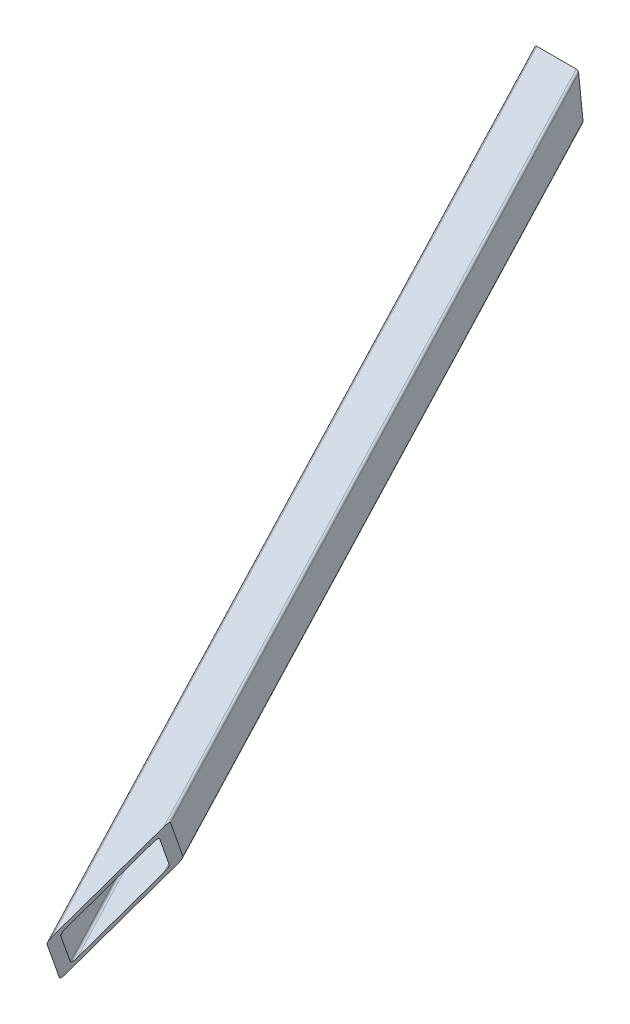
ISO-10303-21;
HEADER;
FILE_DESCRIPTION(('STEP AP214'),'2;1');
FILE_NAME('part.step','',(''),(''),'','','');
FILE_SCHEMA(('AUTOMOTIVE_DESIGN { 1 0 10303 214 1 1 1 1 }'));
ENDSEC;
DATA;
#1=APPLICATION_CONTEXT('core data for automotive mechanical design processes');
#2=APPLICATION_PROTOCOL_DEFINITION('international standard','automotive_design',2000,#1);
#3=PRODUCT_CONTEXT('',#1,'mechanical');
#4=PRODUCT('Part','Part','',(#3));
#5=PRODUCT_RELATED_PRODUCT_CATEGORY('part','',(#4));
#6=PRODUCT_DEFINITION_FORMATION('','',#4);
#7=PRODUCT_DEFINITION_CONTEXT('part definition',#1,'design');
#8=PRODUCT_DEFINITION('design','',#6,#7);
#9=PRODUCT_DEFINITION_SHAPE('','',#8);
#10=(LENGTH_UNIT() NAMED_UNIT(*) SI_UNIT(.MILLI.,.METRE.));
#11=(NAMED_UNIT(*) PLANE_ANGLE_UNIT() SI_UNIT($,.RADIAN.));
#12=(NAMED_UNIT(*) SI_UNIT($,.STERADIAN.) SOLID_ANGLE_UNIT());
#13=UNCERTAINTY_MEASURE_WITH_UNIT(LENGTH_MEASURE(1.E-05),#10,'distance_accuracy_value','');
#14=(GEOMETRIC_REPRESENTATION_CONTEXT(3) GLOBAL_UNCERTAINTY_ASSIGNED_CONTEXT((#13)) GLOBAL_UNIT_ASSIGNED_CONTEXT((#10,
#11,#12)) REPRESENTATION_CONTEXT('',''));
#15=CARTESIAN_POINT('',(0.,0.,0.));
#16=DIRECTION('',(0.,0.,1.));
#17=DIRECTION('',(1.,0.,0.));
#18=AXIS2_PLACEMENT_3D('',#15,#16,#17);
#19=CARTESIAN_POINT('',(0.,0.,0.));
#20=DIRECTION('',(0.,0.,1.));
#21=DIRECTION('',(1.,0.,0.));
#22=AXIS2_PLACEMENT_3D('',#19,#20,#21);
#23=PLANE('',#22);
#24=DIRECTION('',(-0.110232699837685,0.993905806345096,0.));
#25=VECTOR('',#24,1.);
#26=CARTESIAN_POINT('',(28.0475956269496,3.11071951705733,0.));
#27=LINE('',#26,#25);
#28=CARTESIAN_POINT('',(4.46683662482604,215.725064668228,0.));
#29=VERTEX_POINT('',#28);
#30=CARTESIAN_POINT('',(0.235096664464664,253.880266561486,0.));
#31=VERTEX_POINT('',#30);
#32=EDGE_CURVE('E176',#29,#31,#27,.T.);
#33=ORIENTED_EDGE('',*,*,#32,.T.);
#34=CARTESIAN_POINT('',(2.34358835192322,253.880844416911,0.));
#35=DIRECTION('',(0.,0.,1.));
#36=DIRECTION('',(0.709852795777389,-0.704350060926401,0.));
#37=AXIS2_PLACEMENT_3D('',#34,#35,#36);
#38=ELLIPSE('',#37,2.23478809330934,2.);
#39=CARTESIAN_POINT('',(2.10849168745858,256.000577855426,0.));
#40=VERTEX_POINT('',#39);
#41=EDGE_CURVE('E174',#31,#40,#38,.F.);
#42=ORIENTED_EDGE('',*,*,#41,.T.);
#43=DIRECTION('',(-0.999999962445275,-0.000274061030133583,0.));
#44=VECTOR('',#43,1.);
#45=CARTESIAN_POINT('',(257.929821000683,256.0706885151,0.));
#46=LINE('',#45,#44);
#47=CARTESIAN_POINT('',(40.0613420617145,256.010979253086,0.));
#48=VERTEX_POINT('',#47);
#49=EDGE_CURVE('E165',#48,#40,#46,.T.);
#50=ORIENTED_EDGE('',*,*,#49,.F.);
#51=CARTESIAN_POINT('',(40.296438726179,253.891245814572,0.));
#52=DIRECTION('',(0.,0.,1.));
#53=DIRECTION('',(-0.709852795777389,0.704350060926401,0.));
#54=AXIS2_PLACEMENT_3D('',#51,#52,#53);
#55=ELLIPSE('',#54,2.23478809330934,2.);
#56=CARTESIAN_POINT('',(42.4049304136377,253.891823669998,0.));
#57=VERTEX_POINT('',#56);
#58=EDGE_CURVE('E147',#48,#57,#55,.F.);
#59=ORIENTED_EDGE('',*,*,#58,.T.);
#60=DIRECTION('',(-0.110232699837685,0.993905806345096,0.));
#61=VECTOR('',#60,1.);
#62=CARTESIAN_POINT('',(72.8413014840615,-20.535691718011,0.));
#63=LINE('',#62,#61);
#64=CARTESIAN_POINT('',(46.6366703739991,215.73662177674,0.));
#65=VERTEX_POINT('',#64);
#66=EDGE_CURVE('E175',#65,#57,#63,.T.);
#67=ORIENTED_EDGE('',*,*,#66,.F.);
#68=CARTESIAN_POINT('',(44.5281786865403,215.736043921314,0.));
#69=DIRECTION('',(0.,0.,1.));
#70=DIRECTION('',(-0.709852795777389,0.704350060926401,0.));
#71=AXIS2_PLACEMENT_3D('',#68,#69,#70);
#72=ELLIPSE('',#71,2.23478809330934,2.);
#73=CARTESIAN_POINT('',(44.7632753510048,213.6163104828,0.));
#74=VERTEX_POINT('',#73);
#75=EDGE_CURVE('E157',#65,#74,#72,.F.);
#76=ORIENTED_EDGE('',*,*,#75,.T.);
#77=DIRECTION('',(0.999999962445275,0.000274061030133565,0.));
#78=VECTOR('',#77,1.);
#79=CARTESIAN_POINT('',(257.941440080002,213.674734312422,0.));
#80=LINE('',#79,#78);
#81=CARTESIAN_POINT('',(6.81042497674911,213.60590908514,0.));
#82=VERTEX_POINT('',#81);
#83=EDGE_CURVE('E178',#82,#74,#80,.T.);
#84=ORIENTED_EDGE('',*,*,#83,.F.);
#85=CARTESIAN_POINT('',(6.57532831228463,215.725642523654,0.));
#86=DIRECTION('',(0.,0.,1.));
#87=DIRECTION('',(-0.709852795777389,0.704350060926401,0.));
#88=AXIS2_PLACEMENT_3D('',#85,#86,#87);
#89=ELLIPSE('',#88,2.23478809330933,2.);
#90=EDGE_CURVE('E158',#82,#29,#89,.F.);
#91=ORIENTED_EDGE('',*,*,#90,.T.);
#92=EDGE_LOOP('',(#33,#42,#50,#59,#67,#76,#84,#91));
#93=FACE_BOUND('',#92,.T.);
#94=DIRECTION('',(-0.110232699837688,0.993905806345095,0.));
#95=VECTOR('',#94,1.);
#96=CARTESIAN_POINT('',(32.213464011333,3.57275014032918,0.));
#97=LINE('',#96,#95);
#98=CARTESIAN_POINT('',(8.21362667081437,219.965687256108,0.));
#99=VERTEX_POINT('',#98);
#100=CARTESIAN_POINT('',(4.92227336831102,249.641955395308,0.));
#101=VERTEX_POINT('',#100);
#102=EDGE_CURVE('E180',#99,#101,#97,.T.);
#103=ORIENTED_EDGE('',*,*,#102,.F.);
#104=CARTESIAN_POINT('',(10.3221183582731,219.966265111534,0.));
#105=DIRECTION('',(0.,0.,1.));
#106=DIRECTION('',(0.709852795777389,-0.704350060926401,0.));
#107=AXIS2_PLACEMENT_3D('',#104,#105,#106);
#108=ELLIPSE('',#107,2.23478809330934,2.);
#109=CARTESIAN_POINT('',(10.5572150227377,217.846531673019,0.));
#110=VERTEX_POINT('',#109);
#111=EDGE_CURVE('E41',#99,#110,#108,.T.);
#112=ORIENTED_EDGE('',*,*,#111,.T.);
#113=DIRECTION('',(-0.999999962445275,-0.000274061030133465,0.));
#114=VECTOR('',#113,1.);
#115=CARTESIAN_POINT('',(-0.0597024496925761,217.843621989571,0.));
#116=LINE('',#115,#114);
#117=CARTESIAN_POINT('',(40.0760986471583,217.854621648978,0.));
#118=VERTEX_POINT('',#117);
#119=EDGE_CURVE('E263',#118,#110,#116,.T.);
#120=ORIENTED_EDGE('',*,*,#119,.F.);
#121=CARTESIAN_POINT('',(39.8410019826938,219.974355087492,0.));
#122=DIRECTION('',(0.,0.,1.));
#123=DIRECTION('',(0.709852795777389,-0.704350060926401,0.));
#124=AXIS2_PLACEMENT_3D('',#121,#122,#123);
#125=ELLIPSE('',#124,2.23478809330933,2.);
#126=CARTESIAN_POINT('',(41.9494936701525,219.974932942918,0.));
#127=VERTEX_POINT('',#126);
#128=EDGE_CURVE('E257',#118,#127,#125,.T.);
#129=ORIENTED_EDGE('',*,*,#128,.T.);
#130=DIRECTION('',(0.110232699837685,-0.993905806345096,0.));
#131=VECTOR('',#130,1.);
#132=CARTESIAN_POINT('',(65.5404110863942,7.26899512650244,0.));
#133=LINE('',#132,#131);
#134=CARTESIAN_POINT('',(38.6581403676492,249.651201082118,0.));
#135=VERTEX_POINT('',#134);
#136=EDGE_CURVE('E272',#135,#127,#133,.T.);
#137=ORIENTED_EDGE('',*,*,#136,.F.);
#138=CARTESIAN_POINT('',(36.5496486801906,249.650623226692,0.));
#139=DIRECTION('',(0.,0.,1.));
#140=DIRECTION('',(0.709852795777389,-0.704350060926401,0.));
#141=AXIS2_PLACEMENT_3D('',#138,#139,#140);
#142=ELLIPSE('',#141,2.23478809330934,2.);
#143=CARTESIAN_POINT('',(36.314552015726,251.770356665207,0.));
#144=VERTEX_POINT('',#143);
#145=EDGE_CURVE('E48',#135,#144,#142,.T.);
#146=ORIENTED_EDGE('',*,*,#145,.T.);
#147=DIRECTION('',(0.999999962445275,0.000274061030133999,0.));
#148=VECTOR('',#147,1.);
#149=CARTESIAN_POINT('',(-0.0689977131476133,251.760385351713,0.));
#150=LINE('',#149,#148);
#151=CARTESIAN_POINT('',(6.79566839130524,251.762266689248,0.));
#152=VERTEX_POINT('',#151);
#153=EDGE_CURVE('E288',#152,#144,#150,.T.);
#154=ORIENTED_EDGE('',*,*,#153,.F.);
#155=CARTESIAN_POINT('',(7.03076505576977,249.642533250734,0.));
#156=DIRECTION('',(0.,0.,1.));
#157=DIRECTION('',(0.709852795777389,-0.704350060926401,0.));
#158=AXIS2_PLACEMENT_3D('',#155,#156,#157);
#159=ELLIPSE('',#158,2.23478809330933,2.);
#160=EDGE_CURVE('E56',#152,#101,#159,.T.);
#161=ORIENTED_EDGE('',*,*,#160,.T.);
#162=EDGE_LOOP('',(#103,#112,#120,#129,#137,#146,#154,#161));
#163=FACE_BOUND('',#162,.T.);
#164=ADVANCED_FACE('F33',(#93,#163),#23,.F.);
#165=CARTESIAN_POINT('',(258.,260.207945534852,729.000000000001));
#166=DIRECTION('',(-1.,0.,0.));
#167=DIRECTION('',(0.,0.,1.));
#168=AXIS2_PLACEMENT_3D('',#165,#166,#167);
#169=PLANE('',#168);
#170=DIRECTION('',(0.,0.33141177318203,-0.943486214311763));
#171=VECTOR('',#170,1.);
#172=CARTESIAN_POINT('',(258.,-1.11022302462516E-13,729.000000000001));
#173=LINE('',#172,#171);
#174=CARTESIAN_POINT('',(258.,2.09272464608221,723.04228511567));
#175=VERTEX_POINT('',#174);
#176=CARTESIAN_POINT('',(258.,39.7617682755626,615.803417197714));
#177=VERTEX_POINT('',#176);
#178=EDGE_CURVE('E168',#175,#177,#173,.T.);
#179=ORIENTED_EDGE('',*,*,#178,.F.);
#180=CARTESIAN_POINT('',(258.,0.206265417269089,722.37800035445));
#181=DIRECTION('',(-1.,0.,0.));
#182=DIRECTION('',(0.,-0.331330309148028,0.943514825659815));
#183=AXIS2_PLACEMENT_3D('',#180,#181,#182);
#184=ELLIPSE('',#183,6.31457565900196,2.);
#185=CARTESIAN_POINT('',(258.,-1.88645922881318,728.335715238781));
#186=VERTEX_POINT('',#185);
#187=EDGE_CURVE('E214',#175,#186,#184,.F.);
#188=ORIENTED_EDGE('',*,*,#187,.T.);
#189=DIRECTION('',(0.,0.943229300079848,0.332142269924922));
#190=VECTOR('',#189,1.);
#191=CARTESIAN_POINT('',(258.,-1.11022302462516E-13,729.000000000001));
#192=LINE('',#191,#190);
#193=CARTESIAN_POINT('',(258.,-35.8427253474486,716.37858953683));
#194=VERTEX_POINT('',#193);
#195=EDGE_CURVE('E190',#194,#186,#192,.T.);
#196=ORIENTED_EDGE('',*,*,#195,.F.);
#197=CARTESIAN_POINT('',(258.,-33.7500007013663,710.420874652499));
#198=DIRECTION('',(-1.,0.,0.));
#199=DIRECTION('',(0.,0.331330309148028,-0.943514825659816));
#200=AXIS2_PLACEMENT_3D('',#197,#198,#199);
#201=ELLIPSE('',#200,6.31457565900196,2.);
#202=CARTESIAN_POINT('',(258.,-35.6364599301793,709.756589891279));
#203=VERTEX_POINT('',#202);
#204=EDGE_CURVE('E208',#194,#203,#201,.F.);
#205=ORIENTED_EDGE('',*,*,#204,.T.);
#206=DIRECTION('',(0.,-0.33141177318203,0.943486214311763));
#207=VECTOR('',#206,1.);
#208=CARTESIAN_POINT('',(258.,-37.7394498340985,715.743528629556));
#209=LINE('',#208,#207);
#210=CARTESIAN_POINT('',(258.,2.03258369930114,602.517721973324));
#211=VERTEX_POINT('',#210);
#212=EDGE_CURVE('E193',#211,#203,#209,.T.);
#213=ORIENTED_EDGE('',*,*,#212,.F.);
#214=CARTESIAN_POINT('',(258.,3.91904292811412,603.182006734544));
#215=DIRECTION('',(-1.,0.,0.));
#216=DIRECTION('',(0.,0.331330309148028,-0.943514825659816));
#217=AXIS2_PLACEMENT_3D('',#214,#215,#216);
#218=ELLIPSE('',#217,6.31457565900196,2.);
#219=CARTESIAN_POINT('',(258.,6.01176757419636,597.224291850213));
#220=VERTEX_POINT('',#219);
#221=EDGE_CURVE('E212',#211,#220,#218,.F.);
#222=ORIENTED_EDGE('',*,*,#221,.T.);
#223=DIRECTION('',(0.,-0.943229300079848,-0.332142269924923));
#224=VECTOR('',#223,1.);
#225=CARTESIAN_POINT('',(258.,41.9467358813206,609.878184113947));
#226=LINE('',#225,#224);
#227=CARTESIAN_POINT('',(258.,39.9680336928317,609.181417552164));
#228=VERTEX_POINT('',#227);
#229=EDGE_CURVE('E187',#228,#220,#226,.T.);
#230=ORIENTED_EDGE('',*,*,#229,.F.);
#231=CARTESIAN_POINT('',(258.,37.8753090467495,615.139132436495));
#232=DIRECTION('',(-1.,0.,0.));
#233=DIRECTION('',(0.,0.331330309148029,-0.943514825659815));
#234=AXIS2_PLACEMENT_3D('',#231,#232,#233);
#235=ELLIPSE('',#234,6.31457565900196,2.);
#236=EDGE_CURVE('E210',#228,#177,#235,.F.);
#237=ORIENTED_EDGE('',*,*,#236,.T.);
#238=EDGE_LOOP('',(#179,#188,#196,#205,#213,#222,#230,#237));
#239=FACE_BOUND('',#238,.T.);
#240=DIRECTION('',(0.,-0.943229300079845,-0.33214226992493));
#241=VECTOR('',#240,1.);
#242=CARTESIAN_POINT('',(258.,235.696872143673,798.607408307871));
#243=LINE('',#242,#241);
#244=CARTESIAN_POINT('',(258.,-1.47392839427476,715.09171594768));
#245=VERTEX_POINT('',#244);
#246=CARTESIAN_POINT('',(258.,-27.8843575976576,705.791729290606));
#247=VERTEX_POINT('',#246);
#248=EDGE_CURVE('E170',#245,#247,#243,.T.);
#249=ORIENTED_EDGE('',*,*,#248,.F.);
#250=CARTESIAN_POINT('',(258.,0.6187962518075,709.134001063349));
#251=DIRECTION('',(-1.,0.,0.));
#252=DIRECTION('',(0.,-0.331330309148028,0.943514825659815));
#253=AXIS2_PLACEMENT_3D('',#250,#251,#252);
#254=ELLIPSE('',#253,6.31457565900196,2.);
#255=CARTESIAN_POINT('',(258.,2.50525548062054,709.798285824569));
#256=VERTEX_POINT('',#255);
#257=EDGE_CURVE('E252',#245,#256,#254,.T.);
#258=ORIENTED_EDGE('',*,*,#257,.T.);
#259=DIRECTION('',(0.,-0.33141177318203,0.943486214311763));
#260=VECTOR('',#259,1.);
#261=CARTESIAN_POINT('',(258.,24.8056729422167,646.311897738842));
#262=LINE('',#261,#260);
#263=CARTESIAN_POINT('',(258.,31.8034005257717,626.390277443938));
#264=VERTEX_POINT('',#263);
#265=EDGE_CURVE('E196',#264,#256,#262,.T.);
#266=ORIENTED_EDGE('',*,*,#265,.F.);
#267=CARTESIAN_POINT('',(258.,29.9169412969587,625.725992682718));
#268=DIRECTION('',(-1.,0.,0.));
#269=DIRECTION('',(0.,-0.331330309148028,0.943514825659815));
#270=AXIS2_PLACEMENT_3D('',#267,#268,#269);
#271=ELLIPSE('',#270,6.31457565900196,2.);
#272=CARTESIAN_POINT('',(258.,32.0096659430409,619.768277798387));
#273=VERTEX_POINT('',#272);
#274=EDGE_CURVE('E255',#264,#273,#271,.T.);
#275=ORIENTED_EDGE('',*,*,#274,.T.);
#276=DIRECTION('',(0.,0.943229300079848,0.332142269924923));
#277=VECTOR('',#276,1.);
#278=CARTESIAN_POINT('',(258.,269.25426084873,703.309955599027));
#279=LINE('',#278,#277);
#280=CARTESIAN_POINT('',(258.,5.5992367396579,610.468291141314));
#281=VERTEX_POINT('',#280);
#282=EDGE_CURVE('E199',#281,#273,#279,.T.);
#283=ORIENTED_EDGE('',*,*,#282,.F.);
#284=CARTESIAN_POINT('',(258.,3.50651209357564,616.426006025645));
#285=DIRECTION('',(-1.,0.,0.));
#286=DIRECTION('',(0.,-0.331330309148028,0.943514825659816));
#287=AXIS2_PLACEMENT_3D('',#284,#285,#286);
#288=ELLIPSE('',#287,6.31457565900196,2.);
#289=CARTESIAN_POINT('',(258.,1.62005286476252,615.761721264425));
#290=VERTEX_POINT('',#289);
#291=EDGE_CURVE('E259',#281,#290,#288,.T.);
#292=ORIENTED_EDGE('',*,*,#291,.T.);
#293=DIRECTION('',(0.,0.33141177318203,-0.943486214311763));
#294=VECTOR('',#293,1.);
#295=CARTESIAN_POINT('',(258.,-5.38588692506198,635.706720642486));
#296=LINE('',#295,#294);
#297=CARTESIAN_POINT('',(258.,-27.6780921803885,699.169729645056));
#298=VERTEX_POINT('',#297);
#299=EDGE_CURVE('E202',#298,#290,#296,.T.);
#300=ORIENTED_EDGE('',*,*,#299,.F.);
#301=CARTESIAN_POINT('',(258.,-25.7916329515754,699.834014406276));
#302=DIRECTION('',(-1.,0.,0.));
#303=DIRECTION('',(0.,-0.331330309148028,0.943514825659815));
#304=AXIS2_PLACEMENT_3D('',#301,#302,#303);
#305=ELLIPSE('',#304,6.31457565900196,2.);
#306=EDGE_CURVE('E11',#298,#247,#305,.T.);
#307=ORIENTED_EDGE('',*,*,#306,.T.);
#308=EDGE_LOOP('',(#249,#258,#266,#275,#283,#292,#300,#307));
#309=FACE_BOUND('',#308,.T.);
#310=ADVANCED_FACE('F278',(#239,#309),#169,.F.);
#311=CARTESIAN_POINT('',(258.010342912195,-37.7394473108428,715.743529515883));
#312=DIRECTION('',(-0.000258572804877655,0.943486182771068,0.331411762102952));
#313=DIRECTION('',(0.,-0.33141177318203,0.943486214311763));
#314=AXIS2_PLACEMENT_3D('',#311,#312,#313);
#315=PLANE('',#314);
#316=ORIENTED_EDGE('',*,*,#83,.T.);
#317=DIRECTION('',(-0.31672753768479,0.314272285454675,-0.89493943787679));
#318=VECTOR('',#317,1.);
#319=CARTESIAN_POINT('',(294.053970898535,-33.7418990527337,704.391151372673));
#320=LINE('',#319,#318);
#321=EDGE_CURVE('E249',#74,#211,#320,.F.);
#322=ORIENTED_EDGE('',*,*,#321,.T.);
#323=ORIENTED_EDGE('',*,*,#212,.T.);
#324=DIRECTION('',(-0.31672753768479,0.314272285454675,-0.89493943787679));
#325=VECTOR('',#324,1.);
#326=CARTESIAN_POINT('',(259.907375964108,-37.5290500341002,715.146035929398));
#327=LINE('',#326,#325);
#328=EDGE_CURVE('E246',#203,#82,#327,.T.);
#329=ORIENTED_EDGE('',*,*,#328,.T.);
#330=EDGE_LOOP('',(#316,#322,#323,#329));
#331=FACE_BOUND('',#330,.T.);
#332=ADVANCED_FACE('F316',(#331),#315,.F.);
#333=CARTESIAN_POINT('',(258.,-1.11022302462516E-13,729.000000000001));
#334=DIRECTION('',(0.948516525956314,0.105198638371293,-0.298746793242357));
#335=DIRECTION('',(-0.300413720237824,0.,-0.953808993820498));
#336=AXIS2_PLACEMENT_3D('',#333,#334,#335);
#337=PLANE('',#336);
#338=ORIENTED_EDGE('',*,*,#195,.T.);
#339=DIRECTION('',(0.31672753768479,-0.314272285454675,0.89493943787679));
#340=VECTOR('',#339,1.);
#341=CARTESIAN_POINT('',(258.00051714561,-1.88697236554225,728.337176475795));
#342=LINE('',#341,#340);
#343=EDGE_CURVE('E218',#186,#31,#342,.F.);
#344=ORIENTED_EDGE('',*,*,#343,.T.);
#345=ORIENTED_EDGE('',*,*,#32,.F.);
#346=DIRECTION('',(-0.31672753768479,0.314272285454675,-0.89493943787679));
#347=VECTOR('',#346,1.);
#348=CARTESIAN_POINT('',(258.009825766586,-35.8524749453007,716.406353040088));
#349=LINE('',#348,#347);
#350=EDGE_CURVE('E216',#29,#194,#349,.F.);
#351=ORIENTED_EDGE('',*,*,#350,.T.);
#352=EDGE_LOOP('',(#338,#344,#345,#351));
#353=FACE_BOUND('',#352,.T.);
#354=ADVANCED_FACE('F321',(#353),#337,.F.);
#355=CARTESIAN_POINT('',(295.940661038253,4.2079455348516,717.050128270306));
#356=DIRECTION('',(-0.948516525956314,-0.105198638371293,0.298746793242357));
#357=DIRECTION('',(0.300413720237824,0.,0.953808993820498));
#358=AXIS2_PLACEMENT_3D('',#355,#356,#357);
#359=PLANE('',#358);
#360=ORIENTED_EDGE('',*,*,#229,.T.);
#361=DIRECTION('',(-0.31672753768479,0.314272285454675,-0.89493943787679));
#362=VECTOR('',#361,1.);
#363=CARTESIAN_POINT('',(295.950486804838,-31.644529410449,704.456481310394));
#364=LINE('',#363,#362);
#365=EDGE_CURVE('E243',#220,#65,#364,.T.);
#366=ORIENTED_EDGE('',*,*,#365,.T.);
#367=ORIENTED_EDGE('',*,*,#66,.T.);
#368=DIRECTION('',(-0.31672753768479,0.314272285454675,-0.89493943787679));
#369=VECTOR('',#368,1.);
#370=CARTESIAN_POINT('',(295.941178183863,2.32097316930946,716.3873047461));
#371=LINE('',#370,#369);
#372=EDGE_CURVE('E152',#57,#228,#371,.F.);
#373=ORIENTED_EDGE('',*,*,#372,.T.);
#374=EDGE_LOOP('',(#360,#366,#367,#373));
#375=FACE_BOUND('',#374,.T.);
#376=ADVANCED_FACE('F387',(#375),#359,.F.);
#377=CARTESIAN_POINT('',(258.,-1.11022302462516E-13,729.000000000001));
#378=DIRECTION('',(0.000258572804877672,-0.943486182771068,-0.331411762102952));
#379=DIRECTION('',(0.,0.33141177318203,-0.943486214311763));
#380=AXIS2_PLACEMENT_3D('',#377,#378,#379);
#381=PLANE('',#380);
#382=ORIENTED_EDGE('',*,*,#49,.T.);
#383=DIRECTION('',(0.31672753768479,-0.314272285454675,0.89493943787679));
#384=VECTOR('',#383,1.);
#385=CARTESIAN_POINT('',(259.897033051913,0.21039727674248,728.402506413516));
#386=LINE('',#385,#384);
#387=EDGE_CURVE('E169',#40,#175,#386,.T.);
#388=ORIENTED_EDGE('',*,*,#387,.T.);
#389=ORIENTED_EDGE('',*,*,#178,.T.);
#390=DIRECTION('',(-0.31672753768479,0.314272285454675,-0.89493943787679));
#391=VECTOR('',#390,1.);
#392=CARTESIAN_POINT('',(294.04362798634,3.99754825810902,717.647621856791));
#393=LINE('',#392,#391);
#394=EDGE_CURVE('E151',#177,#48,#393,.T.);
#395=ORIENTED_EDGE('',*,*,#394,.T.);
#396=EDGE_LOOP('',(#382,#388,#389,#395));
#397=FACE_BOUND('',#396,.T.);
#398=ADVANCED_FACE('F163',(#397),#381,.F.);
#399=CARTESIAN_POINT('',(265.550613894426,-7.07955116923331,737.090874852452));
#400=DIRECTION('',(0.948516525956314,0.105198638371296,-0.298746793242356));
#401=DIRECTION('',(-0.300413720237823,0.,-0.953808993820498));
#402=AXIS2_PLACEMENT_3D('',#399,#400,#401);
#403=PLANE('',#402);
#404=ORIENTED_EDGE('',*,*,#102,.T.);
#405=DIRECTION('',(-0.31672753768479,0.314272285454675,-0.89493943787679));
#406=VECTOR('',#405,1.);
#407=CARTESIAN_POINT('',(258.00051714561,-1.47444153100385,715.093177184694));
#408=LINE('',#407,#406);
#409=EDGE_CURVE('E230',#101,#245,#408,.F.);
#410=ORIENTED_EDGE('',*,*,#409,.T.);
#411=ORIENTED_EDGE('',*,*,#248,.T.);
#412=DIRECTION('',(-0.31672753768479,0.314272285454675,-0.89493943787679));
#413=VECTOR('',#412,1.);
#414=CARTESIAN_POINT('',(8.44820618966913,219.732926183136,0.662823524205838));
#415=LINE('',#414,#413);
#416=EDGE_CURVE('E227',#247,#99,#415,.T.);
#417=ORIENTED_EDGE('',*,*,#416,.T.);
#418=EDGE_LOOP('',(#404,#410,#411,#417));
#419=FACE_BOUND('',#418,.T.);
#420=ADVANCED_FACE('F281',(#419),#403,.T.);
#421=CARTESIAN_POINT('',(265.558888224182,-37.2711090179074,726.485698465158));
#422=DIRECTION('',(-0.00025857280487756,0.943486182771068,0.331411762102952));
#423=DIRECTION('',(0.,-0.33141177318203,0.943486214311763));
#424=AXIS2_PLACEMENT_3D('',#421,#422,#423);
#425=PLANE('',#424);
#426=ORIENTED_EDGE('',*,*,#299,.T.);
#427=DIRECTION('',(-0.31672753768479,0.314272285454675,-0.89493943787679));
#428=VECTOR('',#427,1.);
#429=CARTESIAN_POINT('',(40.2875572827042,217.644802227661,0.597493586484499));
#430=LINE('',#429,#428);
#431=EDGE_CURVE('E239',#290,#118,#430,.T.);
#432=ORIENTED_EDGE('',*,*,#431,.T.);
#433=ORIENTED_EDGE('',*,*,#119,.T.);
#434=DIRECTION('',(-0.31672753768479,0.314272285454675,-0.89493943787679));
#435=VECTOR('',#434,1.);
#436=CARTESIAN_POINT('',(259.897033051913,-29.5604195497282,704.529950942902));
#437=LINE('',#436,#435);
#438=EDGE_CURVE('E237',#110,#298,#437,.F.);
#439=ORIENTED_EDGE('',*,*,#438,.T.);
#440=EDGE_LOOP('',(#426,#432,#433,#439));
#441=FACE_BOUND('',#440,.T.);
#442=ADVANCED_FACE('F269',(#441),#425,.T.);
#443=CARTESIAN_POINT('',(295.903142725028,-3.71319474135196,727.530977468697));
#444=DIRECTION('',(-0.948516525956314,-0.105198638371293,0.298746793242357));
#445=DIRECTION('',(0.300413720237824,0.,0.953808993820498));
#446=AXIS2_PLACEMENT_3D('',#443,#444,#445);
#447=PLANE('',#446);
#448=ORIENTED_EDGE('',*,*,#282,.T.);
#449=DIRECTION('',(-0.31672753768479,0.314272285454675,-0.89493943787679));
#450=VECTOR('',#449,1.);
#451=CARTESIAN_POINT('',(38.4235608487944,249.88396215509,-0.662823524206061));
#452=LINE('',#451,#450);
#453=EDGE_CURVE('E234',#273,#135,#452,.T.);
#454=ORIENTED_EDGE('',*,*,#453,.T.);
#455=ORIENTED_EDGE('',*,*,#136,.T.);
#456=DIRECTION('',(-0.31672753768479,0.314272285454675,-0.89493943787679));
#457=VECTOR('',#456,1.);
#458=CARTESIAN_POINT('',(257.99948285439,5.59974987638698,610.4668299043));
#459=LINE('',#458,#457);
#460=EDGE_CURVE('E232',#127,#281,#459,.F.);
#461=ORIENTED_EDGE('',*,*,#460,.T.);
#462=EDGE_LOOP('',(#448,#454,#455,#461));
#463=FACE_BOUND('',#462,.T.);
#464=ADVANCED_FACE('F295',(#463),#447,.T.);
#465=CARTESIAN_POINT('',(265.550613894426,-7.07955116923331,737.090874852452));
#466=DIRECTION('',(0.000258572804878064,-0.943486182771068,-0.331411762102952));
#467=DIRECTION('',(0.,0.33141177318203,-0.943486214311763));
#468=AXIS2_PLACEMENT_3D('',#465,#466,#467);
#469=PLANE('',#468);
#470=ORIENTED_EDGE('',*,*,#265,.T.);
#471=DIRECTION('',(-0.31672753768479,0.314272285454675,-0.89493943787679));
#472=VECTOR('',#471,1.);
#473=CARTESIAN_POINT('',(6.58420975575915,251.972086110565,-0.597493586484868));
#474=LINE('',#473,#472);
#475=EDGE_CURVE('E225',#256,#152,#474,.T.);
#476=ORIENTED_EDGE('',*,*,#475,.T.);
#477=ORIENTED_EDGE('',*,*,#153,.T.);
#478=DIRECTION('',(-0.31672753768479,0.314272285454675,-0.89493943787679));
#479=VECTOR('',#478,1.);
#480=CARTESIAN_POINT('',(256.102966948088,33.6857278951114,621.030056146091));
#481=LINE('',#480,#479);
#482=EDGE_CURVE('E223',#144,#264,#481,.F.);
#483=ORIENTED_EDGE('',*,*,#482,.T.);
#484=EDGE_LOOP('',(#470,#476,#477,#483));
#485=FACE_BOUND('',#484,.T.);
#486=ADVANCED_FACE('F286',(#485),#469,.T.);
#487=CARTESIAN_POINT('',(259.897550197523,-1.67657508879966,727.73968288931));
#488=DIRECTION('',(0.31672753768479,-0.314272285454675,0.89493943787679));
#489=DIRECTION('',(0.942703502643969,0.,-0.33363169229375));
#490=AXIS2_PLACEMENT_3D('',#487,#488,#489);
#491=CYLINDRICAL_SURFACE('',#490,2.);
#492=ORIENTED_EDGE('',*,*,#41,.F.);
#493=ORIENTED_EDGE('',*,*,#343,.F.);
#494=ORIENTED_EDGE('',*,*,#187,.F.);
#495=ORIENTED_EDGE('',*,*,#387,.F.);
#496=EDGE_LOOP('',(#492,#493,#494,#495));
#497=FACE_BOUND('',#496,.T.);
#498=ADVANCED_FACE('F323',(#497),#491,.T.);
#499=CARTESIAN_POINT('',(267.448164091949,-8.75612625803286,735.830557741761));
#500=DIRECTION('',(0.31672753768479,-0.314272285454675,0.89493943787679));
#501=DIRECTION('',(0.942703502643969,0.,-0.33363169229375));
#502=AXIS2_PLACEMENT_3D('',#499,#500,#501);
#503=CYLINDRICAL_SURFACE('',#502,2.);
#504=ORIENTED_EDGE('',*,*,#257,.F.);
#505=ORIENTED_EDGE('',*,*,#409,.F.);
#506=ORIENTED_EDGE('',*,*,#160,.F.);
#507=ORIENTED_EDGE('',*,*,#475,.F.);
#508=EDGE_LOOP('',(#504,#505,#506,#507));
#509=FACE_BOUND('',#508,.T.);
#510=ADVANCED_FACE('F282',(#509),#503,.F.);
#511=CARTESIAN_POINT('',(294.006626818725,-5.8105643836367,727.465647530976));
#512=DIRECTION('',(0.31672753768479,-0.314272285454675,0.89493943787679));
#513=DIRECTION('',(0.942703502643969,0.,-0.33363169229375));
#514=AXIS2_PLACEMENT_3D('',#511,#512,#513);
#515=CYLINDRICAL_SURFACE('',#514,2.);
#516=ORIENTED_EDGE('',*,*,#274,.F.);
#517=ORIENTED_EDGE('',*,*,#482,.F.);
#518=ORIENTED_EDGE('',*,*,#145,.F.);
#519=ORIENTED_EDGE('',*,*,#453,.F.);
#520=EDGE_LOOP('',(#516,#517,#518,#519));
#521=FACE_BOUND('',#520,.T.);
#522=ADVANCED_FACE('F290',(#521),#515,.F.);
#523=CARTESIAN_POINT('',(294.013866857262,-32.2281775012265,718.186118192093));
#524=DIRECTION('',(0.31672753768479,-0.314272285454675,0.89493943787679));
#525=DIRECTION('',(0.942703502643969,0.,-0.33363169229375));
#526=AXIS2_PLACEMENT_3D('',#523,#524,#525);
#527=CYLINDRICAL_SURFACE('',#526,2.);
#528=ORIENTED_EDGE('',*,*,#291,.F.);
#529=ORIENTED_EDGE('',*,*,#460,.F.);
#530=ORIENTED_EDGE('',*,*,#128,.F.);
#531=ORIENTED_EDGE('',*,*,#431,.F.);
#532=EDGE_LOOP('',(#528,#529,#530,#531));
#533=FACE_BOUND('',#532,.T.);
#534=ADVANCED_FACE('F299',(#533),#527,.F.);
#535=CARTESIAN_POINT('',(267.455404130485,-35.1737393756226,726.551028402879));
#536=DIRECTION('',(0.31672753768479,-0.314272285454675,0.89493943787679));
#537=DIRECTION('',(0.942703502643969,0.,-0.33363169229375));
#538=AXIS2_PLACEMENT_3D('',#535,#536,#537);
#539=CYLINDRICAL_SURFACE('',#538,2.);
#540=ORIENTED_EDGE('',*,*,#306,.F.);
#541=ORIENTED_EDGE('',*,*,#438,.F.);
#542=ORIENTED_EDGE('',*,*,#111,.F.);
#543=ORIENTED_EDGE('',*,*,#416,.F.);
#544=EDGE_LOOP('',(#540,#541,#542,#543));
#545=FACE_BOUND('',#544,.T.);
#546=ADVANCED_FACE('F275',(#545),#539,.F.);
#547=CARTESIAN_POINT('',(294.053453752925,-31.8549266871916,705.053974896879));
#548=DIRECTION('',(-0.31672753768479,0.314272285454675,-0.89493943787679));
#549=DIRECTION('',(-0.942703502643969,0.,0.33363169229375));
#550=AXIS2_PLACEMENT_3D('',#547,#548,#549);
#551=CYLINDRICAL_SURFACE('',#550,2.);
#552=ORIENTED_EDGE('',*,*,#221,.F.);
#553=ORIENTED_EDGE('',*,*,#321,.F.);
#554=ORIENTED_EDGE('',*,*,#75,.F.);
#555=ORIENTED_EDGE('',*,*,#365,.F.);
#556=EDGE_LOOP('',(#552,#553,#554,#555));
#557=FACE_BOUND('',#556,.T.);
#558=ADVANCED_FACE('F308',(#557),#551,.T.);
#559=CARTESIAN_POINT('',(294.04414513195,2.11057589256687,716.984798332585));
#560=DIRECTION('',(-0.31672753768479,0.314272285454675,-0.89493943787679));
#561=DIRECTION('',(-0.942703502643969,0.,0.33363169229375));
#562=AXIS2_PLACEMENT_3D('',#559,#560,#561);
#563=CYLINDRICAL_SURFACE('',#562,2.);
#564=ORIENTED_EDGE('',*,*,#236,.F.);
#565=ORIENTED_EDGE('',*,*,#372,.F.);
#566=ORIENTED_EDGE('',*,*,#58,.F.);
#567=ORIENTED_EDGE('',*,*,#394,.F.);
#568=EDGE_LOOP('',(#564,#565,#566,#567));
#569=FACE_BOUND('',#568,.T.);
#570=ADVANCED_FACE('F150',(#569),#563,.T.);
#571=CARTESIAN_POINT('',(259.906858818498,-35.6420776685581,715.808859453604));
#572=DIRECTION('',(-0.31672753768479,0.314272285454675,-0.89493943787679));
#573=DIRECTION('',(-0.942703502643969,0.,0.33363169229375));
#574=AXIS2_PLACEMENT_3D('',#571,#572,#573);
#575=CYLINDRICAL_SURFACE('',#574,2.);
#576=ORIENTED_EDGE('',*,*,#204,.F.);
#577=ORIENTED_EDGE('',*,*,#350,.F.);
#578=ORIENTED_EDGE('',*,*,#90,.F.);
#579=ORIENTED_EDGE('',*,*,#328,.F.);
#580=EDGE_LOOP('',(#576,#577,#578,#579));
#581=FACE_BOUND('',#580,.T.);
#582=ADVANCED_FACE('F35',(#581),#575,.T.);
#583=CLOSED_SHELL('',(#164,#310,#332,#354,#376,#398,#420,#442,#464,#486,#498,#510,#522,#534,
#546,#558,#570,#582));
#584=MANIFOLD_SOLID_BREP('B2',#583);
#585=ADVANCED_BREP_SHAPE_REPRESENTATION('',(#18,#584),#14);
#586=SHAPE_DEFINITION_REPRESENTATION(#9,#585);
ENDSEC;
END-ISO-10303-21;
